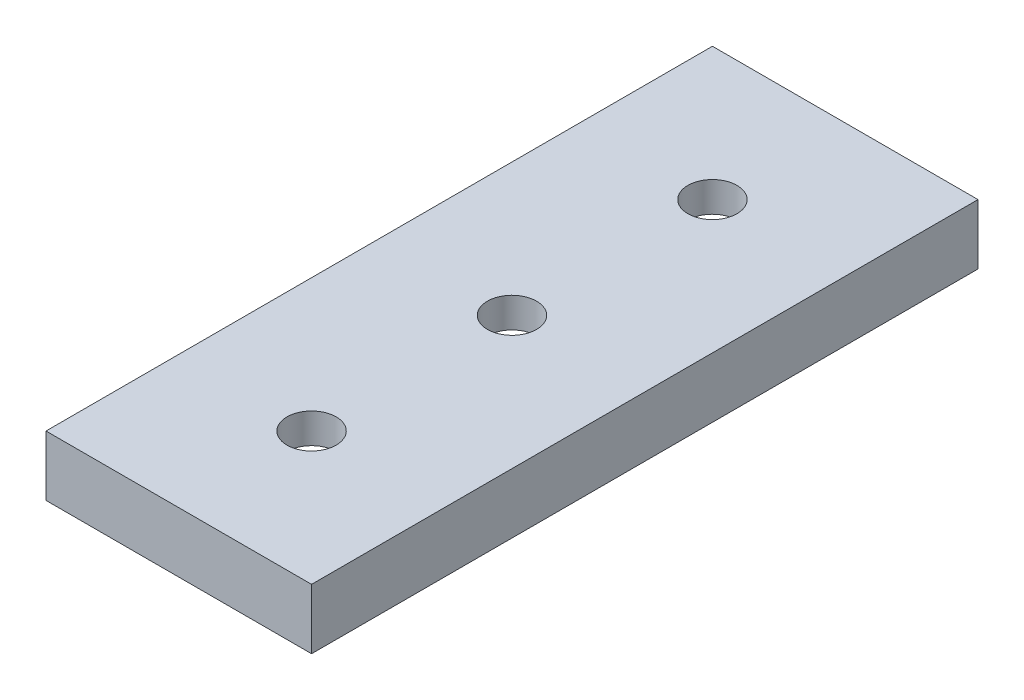
ISO-10303-21;
HEADER;
FILE_DESCRIPTION(('STEP AP214'),'2;1');
FILE_NAME('part.step','',(''),(''),'','','');
FILE_SCHEMA(('AUTOMOTIVE_DESIGN { 1 0 10303 214 1 1 1 1 }'));
ENDSEC;
DATA;
#1=APPLICATION_CONTEXT('core data for automotive mechanical design processes');
#2=APPLICATION_PROTOCOL_DEFINITION('international standard','automotive_design',2000,#1);
#3=PRODUCT_CONTEXT('',#1,'mechanical');
#4=PRODUCT('Part','Part','',(#3));
#5=PRODUCT_RELATED_PRODUCT_CATEGORY('part','',(#4));
#6=PRODUCT_DEFINITION_FORMATION('','',#4);
#7=PRODUCT_DEFINITION_CONTEXT('part definition',#1,'design');
#8=PRODUCT_DEFINITION('design','',#6,#7);
#9=PRODUCT_DEFINITION_SHAPE('','',#8);
#10=(LENGTH_UNIT() NAMED_UNIT(*) SI_UNIT(.MILLI.,.METRE.));
#11=(NAMED_UNIT(*) PLANE_ANGLE_UNIT() SI_UNIT($,.RADIAN.));
#12=(NAMED_UNIT(*) SI_UNIT($,.STERADIAN.) SOLID_ANGLE_UNIT());
#13=UNCERTAINTY_MEASURE_WITH_UNIT(LENGTH_MEASURE(1.E-05),#10,'distance_accuracy_value','');
#14=(GEOMETRIC_REPRESENTATION_CONTEXT(3) GLOBAL_UNCERTAINTY_ASSIGNED_CONTEXT((#13)) GLOBAL_UNIT_ASSIGNED_CONTEXT((#10,
#11,#12)) REPRESENTATION_CONTEXT('',''));
#15=CARTESIAN_POINT('',(0.,0.,0.));
#16=DIRECTION('',(0.,0.,1.));
#17=DIRECTION('',(1.,0.,0.));
#18=AXIS2_PLACEMENT_3D('',#15,#16,#17);
#19=CARTESIAN_POINT('',(0.,3.,0.));
#20=DIRECTION('',(0.,-1.,0.));
#21=DIRECTION('',(0.,0.,-1.));
#22=AXIS2_PLACEMENT_3D('',#19,#20,#21);
#23=PLANE('',#22);
#24=CARTESIAN_POINT('',(10.25,3.,-10.25));
#25=DIRECTION('',(0.,1.,0.));
#26=DIRECTION('',(0.,0.,1.));
#27=AXIS2_PLACEMENT_3D('',#24,#25,#26);
#28=CIRCLE('',#27,2.45);
#29=CARTESIAN_POINT('',(10.25,3.,-7.8));
#30=VERTEX_POINT('',#29);
#31=EDGE_CURVE('E206',#30,#30,#28,.T.);
#32=ORIENTED_EDGE('',*,*,#31,.F.);
#33=EDGE_LOOP('',(#32));
#34=FACE_BOUND('',#33,.T.);
#35=CARTESIAN_POINT('',(10.25,3.,-50.25));
#36=DIRECTION('',(0.,1.,0.));
#37=DIRECTION('',(0.,0.,1.));
#38=AXIS2_PLACEMENT_3D('',#35,#36,#37);
#39=CIRCLE('',#38,2.45);
#40=CARTESIAN_POINT('',(10.25,3.,-47.8));
#41=VERTEX_POINT('',#40);
#42=EDGE_CURVE('E198',#41,#41,#39,.T.);
#43=ORIENTED_EDGE('',*,*,#42,.F.);
#44=EDGE_LOOP('',(#43));
#45=FACE_BOUND('',#44,.T.);
#46=CARTESIAN_POINT('',(10.25,3.,-30.25));
#47=DIRECTION('',(0.,1.,0.));
#48=DIRECTION('',(0.,0.,1.));
#49=AXIS2_PLACEMENT_3D('',#46,#47,#48);
#50=CIRCLE('',#49,2.45);
#51=CARTESIAN_POINT('',(10.25,3.,-27.8));
#52=VERTEX_POINT('',#51);
#53=EDGE_CURVE('E190',#52,#52,#50,.T.);
#54=ORIENTED_EDGE('',*,*,#53,.F.);
#55=EDGE_LOOP('',(#54));
#56=FACE_BOUND('',#55,.T.);
#57=DIRECTION('',(0.,0.,-1.));
#58=VECTOR('',#57,1.);
#59=CARTESIAN_POINT('',(23.5,3.,3.00000000000001));
#60=LINE('',#59,#58);
#61=CARTESIAN_POINT('',(23.5,3.,3.00000000000001));
#62=VERTEX_POINT('',#61);
#63=CARTESIAN_POINT('',(23.5,3.,-63.5));
#64=VERTEX_POINT('',#63);
#65=EDGE_CURVE('E139',#62,#64,#60,.T.);
#66=ORIENTED_EDGE('',*,*,#65,.T.);
#67=DIRECTION('',(-1.,0.,0.));
#68=VECTOR('',#67,1.);
#69=CARTESIAN_POINT('',(-3.,3.,-63.5));
#70=LINE('',#69,#68);
#71=CARTESIAN_POINT('',(-3.,3.,-63.5));
#72=VERTEX_POINT('',#71);
#73=EDGE_CURVE('E167',#64,#72,#70,.T.);
#74=ORIENTED_EDGE('',*,*,#73,.T.);
#75=DIRECTION('',(0.,0.,1.));
#76=VECTOR('',#75,1.);
#77=CARTESIAN_POINT('',(-3.,3.,3.00000000000001));
#78=LINE('',#77,#76);
#79=CARTESIAN_POINT('',(-3.,3.,3.00000000000001));
#80=VERTEX_POINT('',#79);
#81=EDGE_CURVE('E171',#72,#80,#78,.T.);
#82=ORIENTED_EDGE('',*,*,#81,.T.);
#83=DIRECTION('',(1.,0.,0.));
#84=VECTOR('',#83,1.);
#85=CARTESIAN_POINT('',(-3.,3.,3.00000000000001));
#86=LINE('',#85,#84);
#87=EDGE_CURVE('E151',#80,#62,#86,.T.);
#88=ORIENTED_EDGE('',*,*,#87,.T.);
#89=EDGE_LOOP('',(#66,#74,#82,#88));
#90=FACE_BOUND('',#89,.T.);
#91=ADVANCED_FACE('F43',(#34,#45,#56,#90),#23,.F.);
#92=CARTESIAN_POINT('',(0.,0.,0.));
#93=DIRECTION('',(0.,-1.,0.));
#94=DIRECTION('',(0.,0.,-1.));
#95=AXIS2_PLACEMENT_3D('',#92,#93,#94);
#96=PLANE('',#95);
#97=CARTESIAN_POINT('',(10.25,0.,-50.25));
#98=DIRECTION('',(0.,1.,0.));
#99=DIRECTION('',(0.,0.,1.));
#100=AXIS2_PLACEMENT_3D('',#97,#98,#99);
#101=CIRCLE('',#100,2.45);
#102=CARTESIAN_POINT('',(10.25,0.,-47.8));
#103=VERTEX_POINT('',#102);
#104=EDGE_CURVE('E194',#103,#103,#101,.T.);
#105=ORIENTED_EDGE('',*,*,#104,.T.);
#106=EDGE_LOOP('',(#105));
#107=FACE_BOUND('',#106,.T.);
#108=DIRECTION('',(0.,0.,1.));
#109=VECTOR('',#108,1.);
#110=CARTESIAN_POINT('',(0.,0.,0.));
#111=LINE('',#110,#109);
#112=CARTESIAN_POINT('',(0.,0.,-60.5));
#113=VERTEX_POINT('',#112);
#114=CARTESIAN_POINT('',(0.,0.,0.));
#115=VERTEX_POINT('',#114);
#116=EDGE_CURVE('E210',#113,#115,#111,.T.);
#117=ORIENTED_EDGE('',*,*,#116,.F.);
#118=DIRECTION('',(-1.,0.,0.));
#119=VECTOR('',#118,1.);
#120=CARTESIAN_POINT('',(0.,0.,-60.5));
#121=LINE('',#120,#119);
#122=CARTESIAN_POINT('',(20.5,0.,-60.5));
#123=VERTEX_POINT('',#122);
#124=EDGE_CURVE('E11',#123,#113,#121,.T.);
#125=ORIENTED_EDGE('',*,*,#124,.F.);
#126=DIRECTION('',(0.,0.,-1.));
#127=VECTOR('',#126,1.);
#128=CARTESIAN_POINT('',(20.5,0.,0.));
#129=LINE('',#128,#127);
#130=CARTESIAN_POINT('',(20.5,0.,0.));
#131=VERTEX_POINT('',#130);
#132=EDGE_CURVE('E52',#131,#123,#129,.T.);
#133=ORIENTED_EDGE('',*,*,#132,.F.);
#134=DIRECTION('',(1.,0.,0.));
#135=VECTOR('',#134,1.);
#136=CARTESIAN_POINT('',(0.,0.,0.));
#137=LINE('',#136,#135);
#138=EDGE_CURVE('E217',#115,#131,#137,.T.);
#139=ORIENTED_EDGE('',*,*,#138,.F.);
#140=EDGE_LOOP('',(#117,#125,#133,#139));
#141=FACE_BOUND('',#140,.T.);
#142=CARTESIAN_POINT('',(10.25,0.,-10.25));
#143=DIRECTION('',(0.,1.,0.));
#144=DIRECTION('',(0.,0.,1.));
#145=AXIS2_PLACEMENT_3D('',#142,#143,#144);
#146=CIRCLE('',#145,2.45);
#147=CARTESIAN_POINT('',(10.25,0.,-7.8));
#148=VERTEX_POINT('',#147);
#149=EDGE_CURVE('E202',#148,#148,#146,.T.);
#150=ORIENTED_EDGE('',*,*,#149,.T.);
#151=EDGE_LOOP('',(#150));
#152=FACE_BOUND('',#151,.T.);
#153=CARTESIAN_POINT('',(10.25,0.,-30.25));
#154=DIRECTION('',(0.,1.,0.));
#155=DIRECTION('',(0.,0.,1.));
#156=AXIS2_PLACEMENT_3D('',#153,#154,#155);
#157=CIRCLE('',#156,2.45);
#158=CARTESIAN_POINT('',(10.25,0.,-27.8));
#159=VERTEX_POINT('',#158);
#160=EDGE_CURVE('E181',#159,#159,#157,.T.);
#161=ORIENTED_EDGE('',*,*,#160,.T.);
#162=EDGE_LOOP('',(#161));
#163=FACE_BOUND('',#162,.T.);
#164=ADVANCED_FACE('F45',(#107,#141,#152,#163),#96,.T.);
#165=CARTESIAN_POINT('',(10.25,3.,-10.25));
#166=DIRECTION('',(0.,-1.,0.));
#167=DIRECTION('',(0.,0.,-1.));
#168=AXIS2_PLACEMENT_3D('',#165,#166,#167);
#169=CYLINDRICAL_SURFACE('',#168,2.45);
#170=ORIENTED_EDGE('',*,*,#31,.T.);
#171=EDGE_LOOP('',(#170));
#172=FACE_BOUND('',#171,.T.);
#173=ORIENTED_EDGE('',*,*,#149,.F.);
#174=EDGE_LOOP('',(#173));
#175=FACE_BOUND('',#174,.T.);
#176=ADVANCED_FACE('F238',(#172,#175),#169,.F.);
#177=CARTESIAN_POINT('',(10.25,3.,-50.25));
#178=DIRECTION('',(0.,-1.,0.));
#179=DIRECTION('',(0.,0.,-1.));
#180=AXIS2_PLACEMENT_3D('',#177,#178,#179);
#181=CYLINDRICAL_SURFACE('',#180,2.45);
#182=ORIENTED_EDGE('',*,*,#42,.T.);
#183=EDGE_LOOP('',(#182));
#184=FACE_BOUND('',#183,.T.);
#185=ORIENTED_EDGE('',*,*,#104,.F.);
#186=EDGE_LOOP('',(#185));
#187=FACE_BOUND('',#186,.T.);
#188=ADVANCED_FACE('F245',(#184,#187),#181,.F.);
#189=CARTESIAN_POINT('',(10.25,3.,-30.25));
#190=DIRECTION('',(0.,-1.,0.));
#191=DIRECTION('',(0.,0.,-1.));
#192=AXIS2_PLACEMENT_3D('',#189,#190,#191);
#193=CYLINDRICAL_SURFACE('',#192,2.45);
#194=ORIENTED_EDGE('',*,*,#53,.T.);
#195=EDGE_LOOP('',(#194));
#196=FACE_BOUND('',#195,.T.);
#197=ORIENTED_EDGE('',*,*,#160,.F.);
#198=EDGE_LOOP('',(#197));
#199=FACE_BOUND('',#198,.T.);
#200=ADVANCED_FACE('F249',(#196,#199),#193,.F.);
#201=CARTESIAN_POINT('',(23.5,-3.,3.00000000000001));
#202=DIRECTION('',(1.,0.,0.));
#203=DIRECTION('',(0.,0.,-1.));
#204=AXIS2_PLACEMENT_3D('',#201,#202,#203);
#205=PLANE('',#204);
#206=ORIENTED_EDGE('',*,*,#65,.F.);
#207=DIRECTION('',(0.,1.,0.));
#208=VECTOR('',#207,1.);
#209=CARTESIAN_POINT('',(23.5,-3.,3.00000000000001));
#210=LINE('',#209,#208);
#211=CARTESIAN_POINT('',(23.5,-3.,3.00000000000001));
#212=VERTEX_POINT('',#211);
#213=EDGE_CURVE('E178',#212,#62,#210,.T.);
#214=ORIENTED_EDGE('',*,*,#213,.F.);
#215=DIRECTION('',(0.,0.,-1.));
#216=VECTOR('',#215,1.);
#217=CARTESIAN_POINT('',(23.5,-3.,3.00000000000001));
#218=LINE('',#217,#216);
#219=CARTESIAN_POINT('',(23.5,-3.,-63.5));
#220=VERTEX_POINT('',#219);
#221=EDGE_CURVE('E146',#212,#220,#218,.T.);
#222=ORIENTED_EDGE('',*,*,#221,.T.);
#223=DIRECTION('',(0.,1.,0.));
#224=VECTOR('',#223,1.);
#225=CARTESIAN_POINT('',(23.5,-3.,-63.5));
#226=LINE('',#225,#224);
#227=EDGE_CURVE('E163',#220,#64,#226,.T.);
#228=ORIENTED_EDGE('',*,*,#227,.T.);
#229=EDGE_LOOP('',(#206,#214,#222,#228));
#230=FACE_BOUND('',#229,.T.);
#231=ADVANCED_FACE('F253',(#230),#205,.T.);
#232=CARTESIAN_POINT('',(-3.,-3.,3.00000000000001));
#233=DIRECTION('',(0.,0.,1.));
#234=DIRECTION('',(1.,0.,0.));
#235=AXIS2_PLACEMENT_3D('',#232,#233,#234);
#236=PLANE('',#235);
#237=ORIENTED_EDGE('',*,*,#87,.F.);
#238=DIRECTION('',(0.,1.,0.));
#239=VECTOR('',#238,1.);
#240=CARTESIAN_POINT('',(-3.,-3.,3.00000000000001));
#241=LINE('',#240,#239);
#242=CARTESIAN_POINT('',(-3.,-3.,3.00000000000001));
#243=VERTEX_POINT('',#242);
#244=EDGE_CURVE('E182',#243,#80,#241,.T.);
#245=ORIENTED_EDGE('',*,*,#244,.F.);
#246=DIRECTION('',(1.,0.,0.));
#247=VECTOR('',#246,1.);
#248=CARTESIAN_POINT('',(-3.,-3.,3.00000000000001));
#249=LINE('',#248,#247);
#250=EDGE_CURVE('E159',#243,#212,#249,.T.);
#251=ORIENTED_EDGE('',*,*,#250,.T.);
#252=ORIENTED_EDGE('',*,*,#213,.T.);
#253=EDGE_LOOP('',(#237,#245,#251,#252));
#254=FACE_BOUND('',#253,.T.);
#255=ADVANCED_FACE('F257',(#254),#236,.T.);
#256=CARTESIAN_POINT('',(-3.,-3.,3.00000000000001));
#257=DIRECTION('',(-1.,0.,0.));
#258=DIRECTION('',(0.,0.,1.));
#259=AXIS2_PLACEMENT_3D('',#256,#257,#258);
#260=PLANE('',#259);
#261=ORIENTED_EDGE('',*,*,#81,.F.);
#262=DIRECTION('',(0.,1.,0.));
#263=VECTOR('',#262,1.);
#264=CARTESIAN_POINT('',(-3.,-3.,-63.5));
#265=LINE('',#264,#263);
#266=CARTESIAN_POINT('',(-3.,-3.,-63.5));
#267=VERTEX_POINT('',#266);
#268=EDGE_CURVE('E185',#267,#72,#265,.T.);
#269=ORIENTED_EDGE('',*,*,#268,.F.);
#270=DIRECTION('',(0.,0.,1.));
#271=VECTOR('',#270,1.);
#272=CARTESIAN_POINT('',(-3.,-3.,3.00000000000001));
#273=LINE('',#272,#271);
#274=EDGE_CURVE('E155',#267,#243,#273,.T.);
#275=ORIENTED_EDGE('',*,*,#274,.T.);
#276=ORIENTED_EDGE('',*,*,#244,.T.);
#277=EDGE_LOOP('',(#261,#269,#275,#276));
#278=FACE_BOUND('',#277,.T.);
#279=ADVANCED_FACE('F262',(#278),#260,.T.);
#280=CARTESIAN_POINT('',(-3.,-3.,-63.5));
#281=DIRECTION('',(0.,0.,-1.));
#282=DIRECTION('',(-1.,0.,0.));
#283=AXIS2_PLACEMENT_3D('',#280,#281,#282);
#284=PLANE('',#283);
#285=ORIENTED_EDGE('',*,*,#73,.F.);
#286=ORIENTED_EDGE('',*,*,#227,.F.);
#287=DIRECTION('',(-1.,0.,0.));
#288=VECTOR('',#287,1.);
#289=CARTESIAN_POINT('',(-3.,-3.,-63.5));
#290=LINE('',#289,#288);
#291=EDGE_CURVE('E150',#220,#267,#290,.T.);
#292=ORIENTED_EDGE('',*,*,#291,.T.);
#293=ORIENTED_EDGE('',*,*,#268,.T.);
#294=EDGE_LOOP('',(#285,#286,#292,#293));
#295=FACE_BOUND('',#294,.T.);
#296=ADVANCED_FACE('F259',(#295),#284,.T.);
#297=CARTESIAN_POINT('',(0.,-3.,0.));
#298=DIRECTION('',(0.,-1.,0.));
#299=DIRECTION('',(0.,0.,-1.));
#300=AXIS2_PLACEMENT_3D('',#297,#298,#299);
#301=PLANE('',#300);
#302=DIRECTION('',(0.,0.,-1.));
#303=VECTOR('',#302,1.);
#304=CARTESIAN_POINT('',(20.5,-3.,0.));
#305=LINE('',#304,#303);
#306=CARTESIAN_POINT('',(20.5,-3.,0.));
#307=VERTEX_POINT('',#306);
#308=CARTESIAN_POINT('',(20.5,-3.,-60.5));
#309=VERTEX_POINT('',#308);
#310=EDGE_CURVE('E109',#307,#309,#305,.T.);
#311=ORIENTED_EDGE('',*,*,#310,.T.);
#312=DIRECTION('',(-1.,0.,0.));
#313=VECTOR('',#312,1.);
#314=CARTESIAN_POINT('',(0.,-3.,-60.5));
#315=LINE('',#314,#313);
#316=CARTESIAN_POINT('',(0.,-3.,-60.5));
#317=VERTEX_POINT('',#316);
#318=EDGE_CURVE('E118',#309,#317,#315,.T.);
#319=ORIENTED_EDGE('',*,*,#318,.T.);
#320=DIRECTION('',(0.,0.,1.));
#321=VECTOR('',#320,1.);
#322=CARTESIAN_POINT('',(0.,-3.,0.));
#323=LINE('',#322,#321);
#324=CARTESIAN_POINT('',(0.,-3.,0.));
#325=VERTEX_POINT('',#324);
#326=EDGE_CURVE('E124',#317,#325,#323,.T.);
#327=ORIENTED_EDGE('',*,*,#326,.T.);
#328=DIRECTION('',(1.,0.,0.));
#329=VECTOR('',#328,1.);
#330=CARTESIAN_POINT('',(0.,-3.,0.));
#331=LINE('',#330,#329);
#332=EDGE_CURVE('E114',#325,#307,#331,.T.);
#333=ORIENTED_EDGE('',*,*,#332,.T.);
#334=EDGE_LOOP('',(#311,#319,#327,#333));
#335=FACE_BOUND('',#334,.T.);
#336=ORIENTED_EDGE('',*,*,#221,.F.);
#337=ORIENTED_EDGE('',*,*,#250,.F.);
#338=ORIENTED_EDGE('',*,*,#274,.F.);
#339=ORIENTED_EDGE('',*,*,#291,.F.);
#340=EDGE_LOOP('',(#336,#337,#338,#339));
#341=FACE_BOUND('',#340,.T.);
#342=ADVANCED_FACE('F126',(#335,#341),#301,.T.);
#343=CARTESIAN_POINT('',(20.5,-3.,0.));
#344=DIRECTION('',(1.,0.,0.));
#345=DIRECTION('',(0.,0.,-1.));
#346=AXIS2_PLACEMENT_3D('',#343,#344,#345);
#347=PLANE('',#346);
#348=ORIENTED_EDGE('',*,*,#132,.T.);
#349=DIRECTION('',(0.,1.,0.));
#350=VECTOR('',#349,1.);
#351=CARTESIAN_POINT('',(20.5,-3.,-60.5));
#352=LINE('',#351,#350);
#353=EDGE_CURVE('E104',#309,#123,#352,.T.);
#354=ORIENTED_EDGE('',*,*,#353,.F.);
#355=ORIENTED_EDGE('',*,*,#310,.F.);
#356=DIRECTION('',(0.,1.,0.));
#357=VECTOR('',#356,1.);
#358=CARTESIAN_POINT('',(20.5,-3.,0.));
#359=LINE('',#358,#357);
#360=EDGE_CURVE('E136',#307,#131,#359,.T.);
#361=ORIENTED_EDGE('',*,*,#360,.T.);
#362=EDGE_LOOP('',(#348,#354,#355,#361));
#363=FACE_BOUND('',#362,.T.);
#364=ADVANCED_FACE('F106',(#363),#347,.F.);
#365=CARTESIAN_POINT('',(0.,-3.,0.));
#366=DIRECTION('',(0.,0.,1.));
#367=DIRECTION('',(1.,0.,0.));
#368=AXIS2_PLACEMENT_3D('',#365,#366,#367);
#369=PLANE('',#368);
#370=ORIENTED_EDGE('',*,*,#138,.T.);
#371=ORIENTED_EDGE('',*,*,#360,.F.);
#372=ORIENTED_EDGE('',*,*,#332,.F.);
#373=DIRECTION('',(0.,1.,0.));
#374=VECTOR('',#373,1.);
#375=CARTESIAN_POINT('',(0.,-3.,0.));
#376=LINE('',#375,#374);
#377=EDGE_CURVE('E140',#325,#115,#376,.T.);
#378=ORIENTED_EDGE('',*,*,#377,.T.);
#379=EDGE_LOOP('',(#370,#371,#372,#378));
#380=FACE_BOUND('',#379,.T.);
#381=ADVANCED_FACE('F221',(#380),#369,.F.);
#382=CARTESIAN_POINT('',(0.,-3.,0.));
#383=DIRECTION('',(-1.,0.,0.));
#384=DIRECTION('',(0.,0.,1.));
#385=AXIS2_PLACEMENT_3D('',#382,#383,#384);
#386=PLANE('',#385);
#387=ORIENTED_EDGE('',*,*,#116,.T.);
#388=ORIENTED_EDGE('',*,*,#377,.F.);
#389=ORIENTED_EDGE('',*,*,#326,.F.);
#390=DIRECTION('',(0.,1.,0.));
#391=VECTOR('',#390,1.);
#392=CARTESIAN_POINT('',(0.,-3.,-60.5));
#393=LINE('',#392,#391);
#394=EDGE_CURVE('E113',#317,#113,#393,.T.);
#395=ORIENTED_EDGE('',*,*,#394,.T.);
#396=EDGE_LOOP('',(#387,#388,#389,#395));
#397=FACE_BOUND('',#396,.T.);
#398=ADVANCED_FACE('F224',(#397),#386,.F.);
#399=CARTESIAN_POINT('',(0.,-3.,-60.5));
#400=DIRECTION('',(0.,0.,-1.));
#401=DIRECTION('',(-1.,0.,0.));
#402=AXIS2_PLACEMENT_3D('',#399,#400,#401);
#403=PLANE('',#402);
#404=ORIENTED_EDGE('',*,*,#124,.T.);
#405=ORIENTED_EDGE('',*,*,#394,.F.);
#406=ORIENTED_EDGE('',*,*,#318,.F.);
#407=ORIENTED_EDGE('',*,*,#353,.T.);
#408=EDGE_LOOP('',(#404,#405,#406,#407));
#409=FACE_BOUND('',#408,.T.);
#410=ADVANCED_FACE('F119',(#409),#403,.F.);
#411=CLOSED_SHELL('',(#91,#164,#176,#188,#200,#231,#255,#279,#296,#342,#364,#381,#398,#410));
#412=MANIFOLD_SOLID_BREP('B2',#411);
#413=ADVANCED_BREP_SHAPE_REPRESENTATION('',(#18,#412),#14);
#414=SHAPE_DEFINITION_REPRESENTATION(#9,#413);
ENDSEC;
END-ISO-10303-21;
